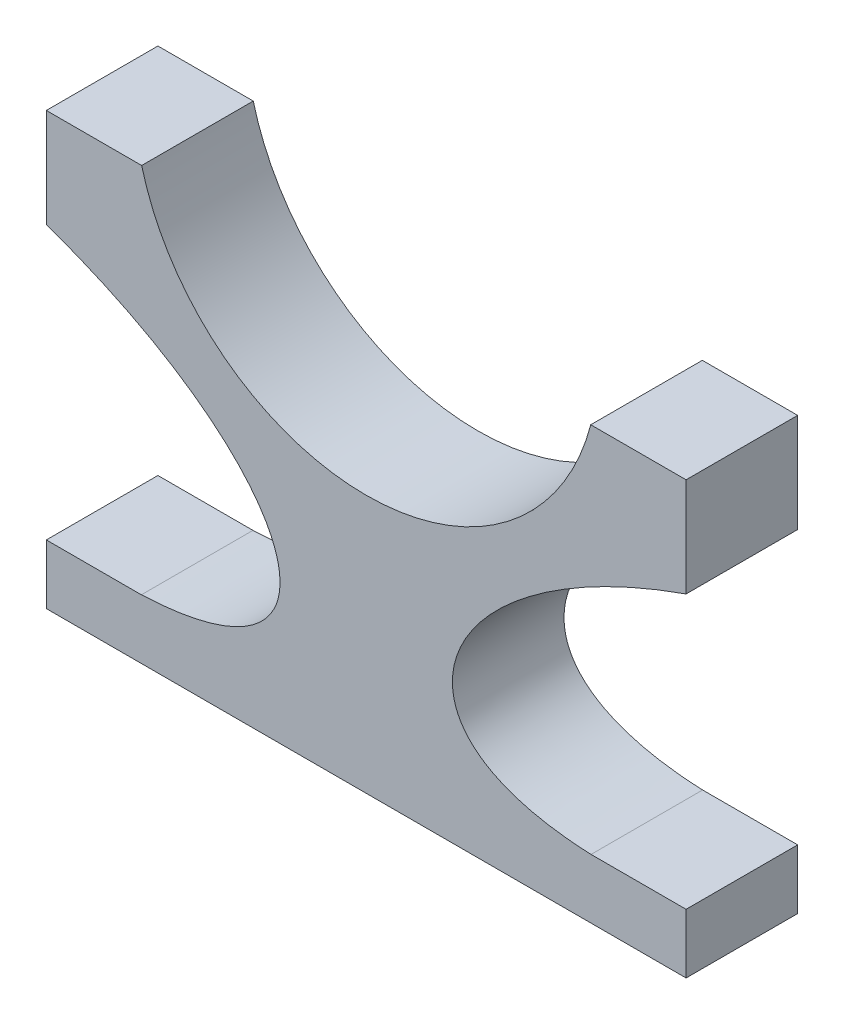
ISO-10303-21;
HEADER;
FILE_DESCRIPTION(('STEP AP214'),'2;1');
FILE_NAME('part.step','',(''),(''),'','','');
FILE_SCHEMA(('AUTOMOTIVE_DESIGN { 1 0 10303 214 1 1 1 1 }'));
ENDSEC;
DATA;
#1=APPLICATION_CONTEXT('core data for automotive mechanical design processes');
#2=APPLICATION_PROTOCOL_DEFINITION('international standard','automotive_design',2000,#1);
#3=PRODUCT_CONTEXT('',#1,'mechanical');
#4=PRODUCT('Part','Part','',(#3));
#5=PRODUCT_RELATED_PRODUCT_CATEGORY('part','',(#4));
#6=PRODUCT_DEFINITION_FORMATION('','',#4);
#7=PRODUCT_DEFINITION_CONTEXT('part definition',#1,'design');
#8=PRODUCT_DEFINITION('design','',#6,#7);
#9=PRODUCT_DEFINITION_SHAPE('','',#8);
#10=(LENGTH_UNIT() NAMED_UNIT(*) SI_UNIT(.MILLI.,.METRE.));
#11=(NAMED_UNIT(*) PLANE_ANGLE_UNIT() SI_UNIT($,.RADIAN.));
#12=(NAMED_UNIT(*) SI_UNIT($,.STERADIAN.) SOLID_ANGLE_UNIT());
#13=UNCERTAINTY_MEASURE_WITH_UNIT(LENGTH_MEASURE(1.E-05),#10,'distance_accuracy_value','');
#14=(GEOMETRIC_REPRESENTATION_CONTEXT(3) GLOBAL_UNCERTAINTY_ASSIGNED_CONTEXT((#13)) GLOBAL_UNIT_ASSIGNED_CONTEXT((#10,
#11,#12)) REPRESENTATION_CONTEXT('',''));
#15=CARTESIAN_POINT('',(0.,0.,0.));
#16=DIRECTION('',(0.,0.,1.));
#17=DIRECTION('',(1.,0.,0.));
#18=AXIS2_PLACEMENT_3D('',#15,#16,#17);
#19=CARTESIAN_POINT('',(86.,0.,15.));
#20=DIRECTION('',(-1.,0.,0.));
#21=DIRECTION('',(0.,-1.,0.));
#22=AXIS2_PLACEMENT_3D('',#19,#20,#21);
#23=PLANE('',#22);
#24=DIRECTION('',(0.,1.,0.));
#25=VECTOR('',#24,1.);
#26=CARTESIAN_POINT('',(86.,0.,0.));
#27=LINE('',#26,#25);
#28=CARTESIAN_POINT('',(86.,-58.,0.));
#29=VERTEX_POINT('',#28);
#30=CARTESIAN_POINT('',(86.,-50.,0.));
#31=VERTEX_POINT('',#30);
#32=EDGE_CURVE('E156',#29,#31,#27,.T.);
#33=ORIENTED_EDGE('',*,*,#32,.T.);
#34=DIRECTION('',(0.,0.,1.));
#35=VECTOR('',#34,1.);
#36=CARTESIAN_POINT('',(86.,-50.,15.));
#37=LINE('',#36,#35);
#38=CARTESIAN_POINT('',(86.,-50.,15.));
#39=VERTEX_POINT('',#38);
#40=EDGE_CURVE('E11',#31,#39,#37,.T.);
#41=ORIENTED_EDGE('',*,*,#40,.T.);
#42=DIRECTION('',(0.,1.,0.));
#43=VECTOR('',#42,1.);
#44=CARTESIAN_POINT('',(86.,0.,15.));
#45=LINE('',#44,#43);
#46=CARTESIAN_POINT('',(86.,-58.,15.));
#47=VERTEX_POINT('',#46);
#48=EDGE_CURVE('E138',#47,#39,#45,.T.);
#49=ORIENTED_EDGE('',*,*,#48,.F.);
#50=DIRECTION('',(0.,0.,-1.));
#51=VECTOR('',#50,1.);
#52=CARTESIAN_POINT('',(86.,-58.,15.));
#53=LINE('',#52,#51);
#54=EDGE_CURVE('E167',#47,#29,#53,.T.);
#55=ORIENTED_EDGE('',*,*,#54,.T.);
#56=EDGE_LOOP('',(#33,#41,#49,#55));
#57=FACE_BOUND('',#56,.T.);
#58=ADVANCED_FACE('F30',(#57),#23,.F.);
#59=CARTESIAN_POINT('',(0.,0.,15.));
#60=DIRECTION('',(1.,0.,0.));
#61=DIRECTION('',(0.,1.,0.));
#62=AXIS2_PLACEMENT_3D('',#59,#60,#61);
#63=PLANE('',#62);
#64=DIRECTION('',(0.,-1.,0.));
#65=VECTOR('',#64,1.);
#66=CARTESIAN_POINT('',(0.,0.,15.));
#67=LINE('',#66,#65);
#68=CARTESIAN_POINT('',(0.,-50.,15.));
#69=VERTEX_POINT('',#68);
#70=CARTESIAN_POINT('',(0.,-58.,15.));
#71=VERTEX_POINT('',#70);
#72=EDGE_CURVE('E163',#69,#71,#67,.T.);
#73=ORIENTED_EDGE('',*,*,#72,.F.);
#74=DIRECTION('',(0.,0.,-1.));
#75=VECTOR('',#74,1.);
#76=CARTESIAN_POINT('',(0.,-50.,15.));
#77=LINE('',#76,#75);
#78=CARTESIAN_POINT('',(0.,-50.,0.));
#79=VERTEX_POINT('',#78);
#80=EDGE_CURVE('E125',#69,#79,#77,.T.);
#81=ORIENTED_EDGE('',*,*,#80,.T.);
#82=DIRECTION('',(0.,-1.,0.));
#83=VECTOR('',#82,1.);
#84=CARTESIAN_POINT('',(0.,0.,0.));
#85=LINE('',#84,#83);
#86=CARTESIAN_POINT('',(0.,-58.,0.));
#87=VERTEX_POINT('',#86);
#88=EDGE_CURVE('E153',#79,#87,#85,.T.);
#89=ORIENTED_EDGE('',*,*,#88,.T.);
#90=DIRECTION('',(0.,0.,-1.));
#91=VECTOR('',#90,1.);
#92=CARTESIAN_POINT('',(0.,-58.,15.));
#93=LINE('',#92,#91);
#94=EDGE_CURVE('E170',#71,#87,#93,.T.);
#95=ORIENTED_EDGE('',*,*,#94,.F.);
#96=EDGE_LOOP('',(#73,#81,#89,#95));
#97=FACE_BOUND('',#96,.T.);
#98=ADVANCED_FACE('F179',(#97),#63,.F.);
#99=CARTESIAN_POINT('',(0.,0.,15.));
#100=DIRECTION('',(0.,-1.,0.));
#101=DIRECTION('',(0.,0.,-1.));
#102=AXIS2_PLACEMENT_3D('',#99,#100,#101);
#103=PLANE('',#102);
#104=DIRECTION('',(0.,0.,-1.));
#105=VECTOR('',#104,1.);
#106=CARTESIAN_POINT('',(12.8157478513136,0.,32.));
#107=LINE('',#106,#105);
#108=CARTESIAN_POINT('',(12.8157478513136,0.,0.));
#109=VERTEX_POINT('',#108);
#110=CARTESIAN_POINT('',(12.8157478513136,0.,15.));
#111=VERTEX_POINT('',#110);
#112=EDGE_CURVE('E191',#109,#111,#107,.F.);
#113=ORIENTED_EDGE('',*,*,#112,.F.);
#114=DIRECTION('',(-1.,0.,0.));
#115=VECTOR('',#114,1.);
#116=CARTESIAN_POINT('',(0.,0.,0.));
#117=LINE('',#116,#115);
#118=CARTESIAN_POINT('',(0.,0.,0.));
#119=VERTEX_POINT('',#118);
#120=EDGE_CURVE('E159',#109,#119,#117,.T.);
#121=ORIENTED_EDGE('',*,*,#120,.T.);
#122=DIRECTION('',(0.,0.,-1.));
#123=VECTOR('',#122,1.);
#124=CARTESIAN_POINT('',(0.,0.,15.));
#125=LINE('',#124,#123);
#126=CARTESIAN_POINT('',(0.,0.,15.));
#127=VERTEX_POINT('',#126);
#128=EDGE_CURVE('E148',#127,#119,#125,.T.);
#129=ORIENTED_EDGE('',*,*,#128,.F.);
#130=DIRECTION('',(-1.,0.,0.));
#131=VECTOR('',#130,1.);
#132=CARTESIAN_POINT('',(0.,0.,15.));
#133=LINE('',#132,#131);
#134=EDGE_CURVE('E141',#111,#127,#133,.T.);
#135=ORIENTED_EDGE('',*,*,#134,.F.);
#136=EDGE_LOOP('',(#113,#121,#129,#135));
#137=FACE_BOUND('',#136,.T.);
#138=ADVANCED_FACE('F245',(#137),#103,.F.);
#139=DIRECTION('',(0.,0.,-1.));
#140=VECTOR('',#139,1.);
#141=CARTESIAN_POINT('',(73.1842521486864,0.,32.));
#142=LINE('',#141,#140);
#143=CARTESIAN_POINT('',(73.1842521486864,0.,15.));
#144=VERTEX_POINT('',#143);
#145=CARTESIAN_POINT('',(73.1842521486864,0.,0.));
#146=VERTEX_POINT('',#145);
#147=EDGE_CURVE('E192',#144,#146,#142,.T.);
#148=ORIENTED_EDGE('',*,*,#147,.F.);
#149=CARTESIAN_POINT('',(86.,0.,15.));
#150=VERTEX_POINT('',#149);
#151=EDGE_CURVE('E146',#150,#144,#133,.T.);
#152=ORIENTED_EDGE('',*,*,#151,.F.);
#153=DIRECTION('',(0.,0.,-1.));
#154=VECTOR('',#153,1.);
#155=CARTESIAN_POINT('',(86.,0.,15.));
#156=LINE('',#155,#154);
#157=CARTESIAN_POINT('',(86.,0.,0.));
#158=VERTEX_POINT('',#157);
#159=EDGE_CURVE('E136',#150,#158,#156,.T.);
#160=ORIENTED_EDGE('',*,*,#159,.T.);
#161=EDGE_CURVE('E160',#158,#146,#117,.T.);
#162=ORIENTED_EDGE('',*,*,#161,.T.);
#163=EDGE_LOOP('',(#148,#152,#160,#162));
#164=FACE_BOUND('',#163,.T.);
#165=ADVANCED_FACE('F242',(#164),#103,.F.);
#166=CARTESIAN_POINT('',(0.,-58.,15.));
#167=DIRECTION('',(0.,0.,1.));
#168=DIRECTION('',(1.,0.,0.));
#169=AXIS2_PLACEMENT_3D('',#166,#167,#168);
#170=PLANE('',#169);
#171=DIRECTION('',(1.,0.,0.));
#172=VECTOR('',#171,1.);
#173=CARTESIAN_POINT('',(86.,-50.,15.));
#174=LINE('',#173,#172);
#175=CARTESIAN_POINT('',(73.2243931308421,-50.,15.));
#176=VERTEX_POINT('',#175);
#177=EDGE_CURVE('E132',#176,#39,#174,.T.);
#178=ORIENTED_EDGE('',*,*,#177,.F.);
#179=CARTESIAN_POINT('',(86.,-13.2928080078777,15.));
#180=CARTESIAN_POINT('',(51.3421450786047,-25.4670902908993,15.));
#181=CARTESIAN_POINT('',(42.8664688054886,-48.7312849443374,15.));
#182=CARTESIAN_POINT('',(73.2243931308421,-50.,15.));
#183=B_SPLINE_CURVE_WITH_KNOTS('',3,(#179,#180,#181,#182),.UNSPECIFIED.,.F.,.F.,(4,4),(0.,
0.936580046174758),.UNSPECIFIED.);
#184=CARTESIAN_POINT('',(86.,-13.2928080078777,15.));
#185=VERTEX_POINT('',#184);
#186=EDGE_CURVE('E120',#185,#176,#183,.T.);
#187=ORIENTED_EDGE('',*,*,#186,.F.);
#188=EDGE_CURVE('E129',#185,#150,#45,.T.);
#189=ORIENTED_EDGE('',*,*,#188,.T.);
#190=ORIENTED_EDGE('',*,*,#151,.T.);
#191=CARTESIAN_POINT('',(43.,7.8962600150021,15.));
#192=DIRECTION('',(0.,0.,1.));
#193=DIRECTION('',(1.,0.,0.));
#194=AXIS2_PLACEMENT_3D('',#191,#192,#193);
#195=CIRCLE('',#194,31.2);
#196=EDGE_CURVE('E197',#144,#111,#195,.F.);
#197=ORIENTED_EDGE('',*,*,#196,.T.);
#198=ORIENTED_EDGE('',*,*,#134,.T.);
#199=CARTESIAN_POINT('',(0.,-13.2928080078777,15.));
#200=VERTEX_POINT('',#199);
#201=EDGE_CURVE('E142',#127,#200,#67,.T.);
#202=ORIENTED_EDGE('',*,*,#201,.T.);
#203=CARTESIAN_POINT('',(12.7756068691578,-50.,15.));
#204=CARTESIAN_POINT('',(43.1335311945114,-48.7312849443374,15.));
#205=CARTESIAN_POINT('',(34.6578549213953,-25.4670902908993,15.));
#206=CARTESIAN_POINT('',(0.,-13.2928080078777,15.));
#207=B_SPLINE_CURVE_WITH_KNOTS('',3,(#203,#204,#205,#206),.UNSPECIFIED.,.F.,.F.,(4,4),(0.,
0.936580046174758),.UNSPECIFIED.);
#208=CARTESIAN_POINT('',(12.7756068691579,-50.,15.));
#209=VERTEX_POINT('',#208);
#210=EDGE_CURVE('E53',#209,#200,#207,.T.);
#211=ORIENTED_EDGE('',*,*,#210,.F.);
#212=DIRECTION('',(1.,0.,0.));
#213=VECTOR('',#212,1.);
#214=CARTESIAN_POINT('',(0.,-50.,15.));
#215=LINE('',#214,#213);
#216=EDGE_CURVE('E204',#69,#209,#215,.T.);
#217=ORIENTED_EDGE('',*,*,#216,.F.);
#218=ORIENTED_EDGE('',*,*,#72,.T.);
#219=DIRECTION('',(1.,0.,0.));
#220=VECTOR('',#219,1.);
#221=CARTESIAN_POINT('',(0.,-58.,15.));
#222=LINE('',#221,#220);
#223=EDGE_CURVE('E139',#71,#47,#222,.T.);
#224=ORIENTED_EDGE('',*,*,#223,.T.);
#225=ORIENTED_EDGE('',*,*,#48,.T.);
#226=EDGE_LOOP('',(#178,#187,#189,#190,#197,#198,#202,#211,#217,#218,#224,#225));
#227=FACE_BOUND('',#226,.T.);
#228=ADVANCED_FACE('F127',(#227),#170,.T.);
#229=CARTESIAN_POINT('',(0.,-58.,0.));
#230=DIRECTION('',(0.,0.,1.));
#231=DIRECTION('',(1.,0.,0.));
#232=AXIS2_PLACEMENT_3D('',#229,#230,#231);
#233=PLANE('',#232);
#234=CARTESIAN_POINT('',(86.,-13.2928080078777,0.));
#235=CARTESIAN_POINT('',(51.3421450786047,-25.4670902908993,0.));
#236=CARTESIAN_POINT('',(42.8664688054886,-48.7312849443374,0.));
#237=CARTESIAN_POINT('',(73.2243931308421,-50.,0.));
#238=B_SPLINE_CURVE_WITH_KNOTS('',3,(#234,#235,#236,#237),.UNSPECIFIED.,.F.,.F.,(4,4),(0.,
0.936580046174758),.UNSPECIFIED.);
#239=CARTESIAN_POINT('',(86.,-13.2928080078777,0.));
#240=VERTEX_POINT('',#239);
#241=CARTESIAN_POINT('',(73.2243931308421,-50.,0.));
#242=VERTEX_POINT('',#241);
#243=EDGE_CURVE('E45',#240,#242,#238,.T.);
#244=ORIENTED_EDGE('',*,*,#243,.T.);
#245=DIRECTION('',(1.,0.,0.));
#246=VECTOR('',#245,1.);
#247=CARTESIAN_POINT('',(0.,-49.9999999999998,0.));
#248=LINE('',#247,#246);
#249=EDGE_CURVE('E212',#242,#31,#248,.T.);
#250=ORIENTED_EDGE('',*,*,#249,.T.);
#251=ORIENTED_EDGE('',*,*,#32,.F.);
#252=DIRECTION('',(1.,0.,0.));
#253=VECTOR('',#252,1.);
#254=CARTESIAN_POINT('',(0.,-58.,0.));
#255=LINE('',#254,#253);
#256=EDGE_CURVE('E152',#87,#29,#255,.T.);
#257=ORIENTED_EDGE('',*,*,#256,.F.);
#258=ORIENTED_EDGE('',*,*,#88,.F.);
#259=DIRECTION('',(1.,0.,0.));
#260=VECTOR('',#259,1.);
#261=CARTESIAN_POINT('',(0.,-50.,0.));
#262=LINE('',#261,#260);
#263=CARTESIAN_POINT('',(12.7756068691579,-50.,0.));
#264=VERTEX_POINT('',#263);
#265=EDGE_CURVE('E189',#79,#264,#262,.T.);
#266=ORIENTED_EDGE('',*,*,#265,.T.);
#267=CARTESIAN_POINT('',(12.7756068691578,-50.,0.));
#268=CARTESIAN_POINT('',(43.1335311945114,-48.7312849443374,0.));
#269=CARTESIAN_POINT('',(34.6578549213953,-25.4670902908993,0.));
#270=CARTESIAN_POINT('',(0.,-13.2928080078777,0.));
#271=B_SPLINE_CURVE_WITH_KNOTS('',3,(#267,#268,#269,#270),.UNSPECIFIED.,.F.,.F.,(4,4),(0.,
0.936580046174758),.UNSPECIFIED.);
#272=CARTESIAN_POINT('',(0.,-13.2928080078777,0.));
#273=VERTEX_POINT('',#272);
#274=EDGE_CURVE('E372',#264,#273,#271,.T.);
#275=ORIENTED_EDGE('',*,*,#274,.T.);
#276=EDGE_CURVE('E149',#119,#273,#85,.T.);
#277=ORIENTED_EDGE('',*,*,#276,.F.);
#278=ORIENTED_EDGE('',*,*,#120,.F.);
#279=CARTESIAN_POINT('',(43.,7.8962600150021,0.));
#280=DIRECTION('',(0.,0.,1.));
#281=DIRECTION('',(1.,0.,0.));
#282=AXIS2_PLACEMENT_3D('',#279,#280,#281);
#283=CIRCLE('',#282,31.2);
#284=EDGE_CURVE('E369',#109,#146,#283,.T.);
#285=ORIENTED_EDGE('',*,*,#284,.T.);
#286=ORIENTED_EDGE('',*,*,#161,.F.);
#287=EDGE_CURVE('E155',#240,#158,#27,.T.);
#288=ORIENTED_EDGE('',*,*,#287,.F.);
#289=EDGE_LOOP('',(#244,#250,#251,#257,#258,#266,#275,#277,#278,#285,#286,#288));
#290=FACE_BOUND('',#289,.T.);
#291=ADVANCED_FACE('F187',(#290),#233,.F.);
#292=ORIENTED_EDGE('',*,*,#276,.T.);
#293=DIRECTION('',(0.,0.,1.));
#294=VECTOR('',#293,1.);
#295=CARTESIAN_POINT('',(0.,-13.2928080078777,15.));
#296=LINE('',#295,#294);
#297=EDGE_CURVE('E173',#273,#200,#296,.T.);
#298=ORIENTED_EDGE('',*,*,#297,.T.);
#299=ORIENTED_EDGE('',*,*,#201,.F.);
#300=ORIENTED_EDGE('',*,*,#128,.T.);
#301=EDGE_LOOP('',(#292,#298,#299,#300));
#302=FACE_BOUND('',#301,.T.);
#303=ADVANCED_FACE('F32',(#302),#63,.F.);
#304=CARTESIAN_POINT('',(0.,-58.,15.));
#305=DIRECTION('',(0.,1.,0.));
#306=DIRECTION('',(0.,0.,1.));
#307=AXIS2_PLACEMENT_3D('',#304,#305,#306);
#308=PLANE('',#307);
#309=ORIENTED_EDGE('',*,*,#256,.T.);
#310=ORIENTED_EDGE('',*,*,#54,.F.);
#311=ORIENTED_EDGE('',*,*,#223,.F.);
#312=ORIENTED_EDGE('',*,*,#94,.T.);
#313=EDGE_LOOP('',(#309,#310,#311,#312));
#314=FACE_BOUND('',#313,.T.);
#315=ADVANCED_FACE('F206',(#314),#308,.F.);
#316=ORIENTED_EDGE('',*,*,#188,.F.);
#317=DIRECTION('',(0.,0.,-1.));
#318=VECTOR('',#317,1.);
#319=CARTESIAN_POINT('',(86.,-13.2928080078777,15.));
#320=LINE('',#319,#318);
#321=EDGE_CURVE('E38',#185,#240,#320,.T.);
#322=ORIENTED_EDGE('',*,*,#321,.T.);
#323=ORIENTED_EDGE('',*,*,#287,.T.);
#324=ORIENTED_EDGE('',*,*,#159,.F.);
#325=EDGE_LOOP('',(#316,#322,#323,#324));
#326=FACE_BOUND('',#325,.T.);
#327=ADVANCED_FACE('F134',(#326),#23,.F.);
#328=CARTESIAN_POINT('',(43.,7.8962600150021,32.));
#329=DIRECTION('',(0.,0.,-1.));
#330=DIRECTION('',(-1.,0.,0.));
#331=AXIS2_PLACEMENT_3D('',#328,#329,#330);
#332=CYLINDRICAL_SURFACE('',#331,31.2);
#333=ORIENTED_EDGE('',*,*,#112,.T.);
#334=ORIENTED_EDGE('',*,*,#196,.F.);
#335=ORIENTED_EDGE('',*,*,#147,.T.);
#336=ORIENTED_EDGE('',*,*,#284,.F.);
#337=EDGE_LOOP('',(#333,#334,#335,#336));
#338=FACE_BOUND('',#337,.T.);
#339=ADVANCED_FACE('F236',(#338),#332,.F.);
#340=CARTESIAN_POINT('',(12.7756068691578,-50.,-17.));
#341=CARTESIAN_POINT('',(43.1335311945114,-48.7312849443374,-17.));
#342=CARTESIAN_POINT('',(34.6578549213953,-25.4670902908993,-17.));
#343=CARTESIAN_POINT('',(0.,-13.2928080078777,-17.));
#344=B_SPLINE_CURVE_WITH_KNOTS('',3,(#340,#341,#342,#343),.UNSPECIFIED.,.F.,.F.,(4,4),(0.,
0.936580046174758),.UNSPECIFIED.);
#345=DIRECTION('',(0.,0.,1.));
#346=VECTOR('',#345,1.);
#347=SURFACE_OF_LINEAR_EXTRUSION('',#344,#346);
#348=DIRECTION('',(0.,0.,1.));
#349=VECTOR('',#348,1.);
#350=CARTESIAN_POINT('',(12.7756068691579,-50.,-17.));
#351=LINE('',#350,#349);
#352=EDGE_CURVE('E376',#264,#209,#351,.T.);
#353=ORIENTED_EDGE('',*,*,#352,.T.);
#354=ORIENTED_EDGE('',*,*,#210,.T.);
#355=ORIENTED_EDGE('',*,*,#297,.F.);
#356=ORIENTED_EDGE('',*,*,#274,.F.);
#357=EDGE_LOOP('',(#353,#354,#355,#356));
#358=FACE_BOUND('',#357,.T.);
#359=ADVANCED_FACE('F231',(#358),#347,.F.);
#360=CARTESIAN_POINT('',(0.,-50.,-17.));
#361=DIRECTION('',(0.,-1.,0.));
#362=DIRECTION('',(1.,0.,0.));
#363=AXIS2_PLACEMENT_3D('',#360,#361,#362);
#364=PLANE('',#363);
#365=ORIENTED_EDGE('',*,*,#80,.F.);
#366=ORIENTED_EDGE('',*,*,#216,.T.);
#367=ORIENTED_EDGE('',*,*,#352,.F.);
#368=ORIENTED_EDGE('',*,*,#265,.F.);
#369=EDGE_LOOP('',(#365,#366,#367,#368));
#370=FACE_BOUND('',#369,.T.);
#371=ADVANCED_FACE('F235',(#370),#364,.F.);
#372=CARTESIAN_POINT('',(86.,-50.,-17.));
#373=DIRECTION('',(0.,-1.,0.));
#374=DIRECTION('',(1.,0.,0.));
#375=AXIS2_PLACEMENT_3D('',#372,#373,#374);
#376=PLANE('',#375);
#377=DIRECTION('',(0.,0.,1.));
#378=VECTOR('',#377,1.);
#379=CARTESIAN_POINT('',(73.2243931308421,-50.,-17.));
#380=LINE('',#379,#378);
#381=EDGE_CURVE('E215',#242,#176,#380,.T.);
#382=ORIENTED_EDGE('',*,*,#381,.T.);
#383=ORIENTED_EDGE('',*,*,#177,.T.);
#384=ORIENTED_EDGE('',*,*,#40,.F.);
#385=ORIENTED_EDGE('',*,*,#249,.F.);
#386=EDGE_LOOP('',(#382,#383,#384,#385));
#387=FACE_BOUND('',#386,.T.);
#388=ADVANCED_FACE('F211',(#387),#376,.F.);
#389=CARTESIAN_POINT('',(86.,-13.2928080078777,-17.));
#390=CARTESIAN_POINT('',(51.3421450786047,-25.4670902908993,-17.));
#391=CARTESIAN_POINT('',(42.8664688054886,-48.7312849443374,-17.));
#392=CARTESIAN_POINT('',(73.2243931308421,-50.,-17.));
#393=B_SPLINE_CURVE_WITH_KNOTS('',3,(#389,#390,#391,#392),.UNSPECIFIED.,.F.,.F.,(4,4),(0.,
0.936580046174758),.UNSPECIFIED.);
#394=DIRECTION('',(0.,0.,1.));
#395=VECTOR('',#394,1.);
#396=SURFACE_OF_LINEAR_EXTRUSION('',#393,#395);
#397=ORIENTED_EDGE('',*,*,#321,.F.);
#398=ORIENTED_EDGE('',*,*,#186,.T.);
#399=ORIENTED_EDGE('',*,*,#381,.F.);
#400=ORIENTED_EDGE('',*,*,#243,.F.);
#401=EDGE_LOOP('',(#397,#398,#399,#400));
#402=FACE_BOUND('',#401,.T.);
#403=ADVANCED_FACE('F119',(#402),#396,.F.);
#404=CLOSED_SHELL('',(#58,#98,#138,#165,#228,#291,#303,#315,#327,#339,#359,#371,#388,#403));
#405=MANIFOLD_SOLID_BREP('B2',#404);
#406=ADVANCED_BREP_SHAPE_REPRESENTATION('',(#18,#405),#14);
#407=SHAPE_DEFINITION_REPRESENTATION(#9,#406);
ENDSEC;
END-ISO-10303-21;
